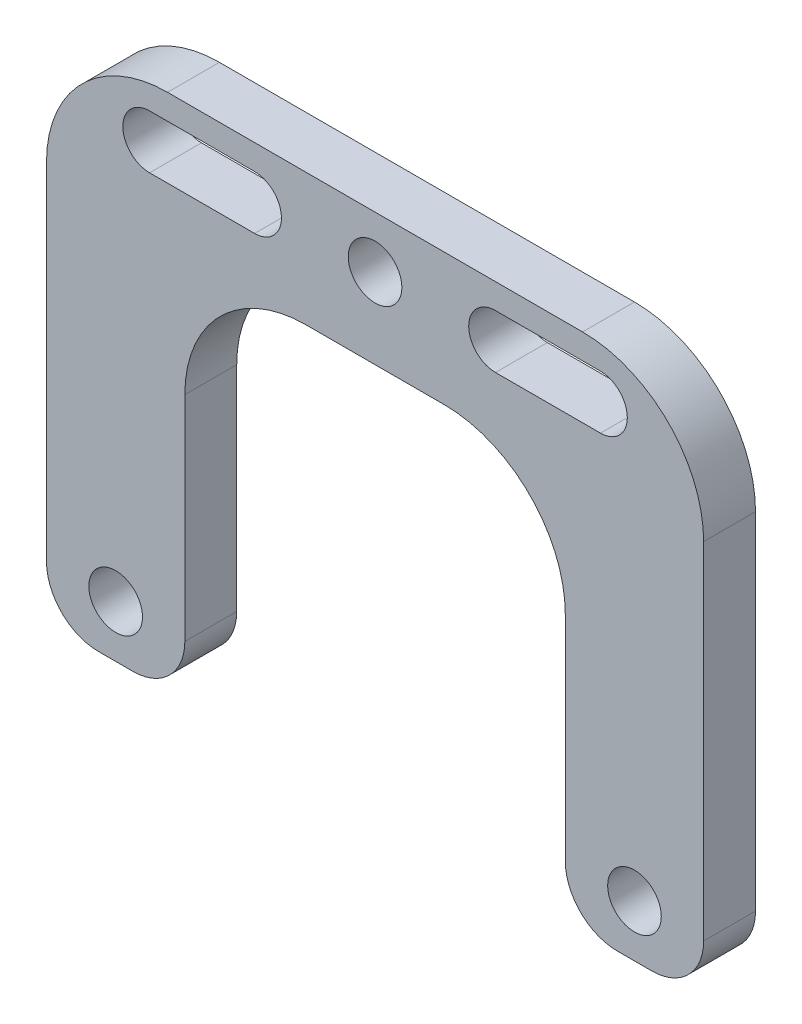
ISO-10303-21;
HEADER;
FILE_DESCRIPTION(('STEP AP214'),'2;1');
FILE_NAME('part.step','',(''),(''),'','','');
FILE_SCHEMA(('AUTOMOTIVE_DESIGN { 1 0 10303 214 1 1 1 1 }'));
ENDSEC;
DATA;
#1=APPLICATION_CONTEXT('core data for automotive mechanical design processes');
#2=APPLICATION_PROTOCOL_DEFINITION('international standard','automotive_design',2000,#1);
#3=PRODUCT_CONTEXT('',#1,'mechanical');
#4=PRODUCT('Part','Part','',(#3));
#5=PRODUCT_RELATED_PRODUCT_CATEGORY('part','',(#4));
#6=PRODUCT_DEFINITION_FORMATION('','',#4);
#7=PRODUCT_DEFINITION_CONTEXT('part definition',#1,'design');
#8=PRODUCT_DEFINITION('design','',#6,#7);
#9=PRODUCT_DEFINITION_SHAPE('','',#8);
#10=(LENGTH_UNIT() NAMED_UNIT(*) SI_UNIT(.MILLI.,.METRE.));
#11=(NAMED_UNIT(*) PLANE_ANGLE_UNIT() SI_UNIT($,.RADIAN.));
#12=(NAMED_UNIT(*) SI_UNIT($,.STERADIAN.) SOLID_ANGLE_UNIT());
#13=UNCERTAINTY_MEASURE_WITH_UNIT(LENGTH_MEASURE(1.E-05),#10,'distance_accuracy_value','');
#14=(GEOMETRIC_REPRESENTATION_CONTEXT(3) GLOBAL_UNCERTAINTY_ASSIGNED_CONTEXT((#13)) GLOBAL_UNIT_ASSIGNED_CONTEXT((#10,
#11,#12)) REPRESENTATION_CONTEXT('',''));
#15=CARTESIAN_POINT('',(0.,0.,0.));
#16=DIRECTION('',(0.,0.,1.));
#17=DIRECTION('',(1.,0.,0.));
#18=AXIS2_PLACEMENT_3D('',#15,#16,#17);
#19=CARTESIAN_POINT('',(19.,-15.,3.));
#20=DIRECTION('',(0.,1.,0.));
#21=DIRECTION('',(-1.,0.,0.));
#22=AXIS2_PLACEMENT_3D('',#19,#20,#21);
#23=PLANE('',#22);
#24=DIRECTION('',(1.,0.,0.));
#25=VECTOR('',#24,1.);
#26=CARTESIAN_POINT('',(19.,-15.,0.));
#27=LINE('',#26,#25);
#28=CARTESIAN_POINT('',(-16.,-15.,0.));
#29=VERTEX_POINT('',#28);
#30=CARTESIAN_POINT('',(-14.,-15.,0.));
#31=VERTEX_POINT('',#30);
#32=EDGE_CURVE('E282',#29,#31,#27,.T.);
#33=ORIENTED_EDGE('',*,*,#32,.T.);
#34=DIRECTION('',(0.,0.,1.));
#35=VECTOR('',#34,1.);
#36=CARTESIAN_POINT('',(-14.,-15.,3.));
#37=LINE('',#36,#35);
#38=CARTESIAN_POINT('',(-14.,-15.,3.));
#39=VERTEX_POINT('',#38);
#40=EDGE_CURVE('E390',#31,#39,#37,.T.);
#41=ORIENTED_EDGE('',*,*,#40,.T.);
#42=DIRECTION('',(1.,0.,0.));
#43=VECTOR('',#42,1.);
#44=CARTESIAN_POINT('',(19.,-15.,3.));
#45=LINE('',#44,#43);
#46=CARTESIAN_POINT('',(-16.,-15.,3.));
#47=VERTEX_POINT('',#46);
#48=EDGE_CURVE('E269',#47,#39,#45,.T.);
#49=ORIENTED_EDGE('',*,*,#48,.F.);
#50=DIRECTION('',(0.,0.,-1.));
#51=VECTOR('',#50,1.);
#52=CARTESIAN_POINT('',(-16.,-15.,3.));
#53=LINE('',#52,#51);
#54=EDGE_CURVE('E387',#47,#29,#53,.T.);
#55=ORIENTED_EDGE('',*,*,#54,.T.);
#56=EDGE_LOOP('',(#33,#41,#49,#55));
#57=FACE_BOUND('',#56,.T.);
#58=ADVANCED_FACE('F37',(#57),#23,.F.);
#59=CARTESIAN_POINT('',(-19.,-15.,3.));
#60=DIRECTION('',(1.,0.,0.));
#61=DIRECTION('',(0.,0.,-1.));
#62=AXIS2_PLACEMENT_3D('',#59,#60,#61);
#63=PLANE('',#62);
#64=DIRECTION('',(0.,-1.,0.));
#65=VECTOR('',#64,1.);
#66=CARTESIAN_POINT('',(-19.,-15.,0.));
#67=LINE('',#66,#65);
#68=CARTESIAN_POINT('',(-19.,8.,0.));
#69=VERTEX_POINT('',#68);
#70=CARTESIAN_POINT('',(-19.,-12.,0.));
#71=VERTEX_POINT('',#70);
#72=EDGE_CURVE('E277',#69,#71,#67,.T.);
#73=ORIENTED_EDGE('',*,*,#72,.T.);
#74=DIRECTION('',(0.,0.,-1.));
#75=VECTOR('',#74,1.);
#76=CARTESIAN_POINT('',(-19.,-12.,3.));
#77=LINE('',#76,#75);
#78=CARTESIAN_POINT('',(-19.,-12.,3.));
#79=VERTEX_POINT('',#78);
#80=EDGE_CURVE('E11',#71,#79,#77,.F.);
#81=ORIENTED_EDGE('',*,*,#80,.T.);
#82=DIRECTION('',(0.,-1.,0.));
#83=VECTOR('',#82,1.);
#84=CARTESIAN_POINT('',(-19.,-15.,3.));
#85=LINE('',#84,#83);
#86=CARTESIAN_POINT('',(-19.,8.,3.));
#87=VERTEX_POINT('',#86);
#88=EDGE_CURVE('E264',#87,#79,#85,.T.);
#89=ORIENTED_EDGE('',*,*,#88,.F.);
#90=DIRECTION('',(0.,0.,-1.));
#91=VECTOR('',#90,1.);
#92=CARTESIAN_POINT('',(-19.,8.,3.));
#93=LINE('',#92,#91);
#94=EDGE_CURVE('E340',#87,#69,#93,.T.);
#95=ORIENTED_EDGE('',*,*,#94,.T.);
#96=EDGE_LOOP('',(#73,#81,#89,#95));
#97=FACE_BOUND('',#96,.T.);
#98=ADVANCED_FACE('F418',(#97),#63,.F.);
#99=CARTESIAN_POINT('',(14.,-15.,0.));
#100=VERTEX_POINT('',#99);
#101=CARTESIAN_POINT('',(16.,-15.,0.));
#102=VERTEX_POINT('',#101);
#103=EDGE_CURVE('E280',#100,#102,#27,.T.);
#104=ORIENTED_EDGE('',*,*,#103,.T.);
#105=DIRECTION('',(0.,0.,-1.));
#106=VECTOR('',#105,1.);
#107=CARTESIAN_POINT('',(16.,-15.,3.));
#108=LINE('',#107,#106);
#109=CARTESIAN_POINT('',(16.,-15.,3.));
#110=VERTEX_POINT('',#109);
#111=EDGE_CURVE('E377',#102,#110,#108,.F.);
#112=ORIENTED_EDGE('',*,*,#111,.T.);
#113=CARTESIAN_POINT('',(14.,-15.,3.));
#114=VERTEX_POINT('',#113);
#115=EDGE_CURVE('E267',#114,#110,#45,.T.);
#116=ORIENTED_EDGE('',*,*,#115,.F.);
#117=DIRECTION('',(0.,0.,1.));
#118=VECTOR('',#117,1.);
#119=CARTESIAN_POINT('',(14.,-15.,3.));
#120=LINE('',#119,#118);
#121=EDGE_CURVE('E375',#114,#100,#120,.F.);
#122=ORIENTED_EDGE('',*,*,#121,.T.);
#123=EDGE_LOOP('',(#104,#112,#116,#122));
#124=FACE_BOUND('',#123,.T.);
#125=ADVANCED_FACE('F445',(#124),#23,.F.);
#126=CARTESIAN_POINT('',(19.,-15.,3.));
#127=DIRECTION('',(-1.,0.,0.));
#128=DIRECTION('',(0.,-1.,0.));
#129=AXIS2_PLACEMENT_3D('',#126,#127,#128);
#130=PLANE('',#129);
#131=DIRECTION('',(0.,1.,0.));
#132=VECTOR('',#131,1.);
#133=CARTESIAN_POINT('',(19.,-15.,3.));
#134=LINE('',#133,#132);
#135=CARTESIAN_POINT('',(19.,-12.,3.));
#136=VERTEX_POINT('',#135);
#137=CARTESIAN_POINT('',(19.,8.,3.));
#138=VERTEX_POINT('',#137);
#139=EDGE_CURVE('E271',#136,#138,#134,.T.);
#140=ORIENTED_EDGE('',*,*,#139,.F.);
#141=DIRECTION('',(0.,0.,-1.));
#142=VECTOR('',#141,1.);
#143=CARTESIAN_POINT('',(19.,-12.,3.));
#144=LINE('',#143,#142);
#145=CARTESIAN_POINT('',(19.,-12.,0.));
#146=VERTEX_POINT('',#145);
#147=EDGE_CURVE('E364',#136,#146,#144,.T.);
#148=ORIENTED_EDGE('',*,*,#147,.T.);
#149=DIRECTION('',(0.,1.,0.));
#150=VECTOR('',#149,1.);
#151=CARTESIAN_POINT('',(19.,-15.,0.));
#152=LINE('',#151,#150);
#153=CARTESIAN_POINT('',(19.,8.,0.));
#154=VERTEX_POINT('',#153);
#155=EDGE_CURVE('E285',#146,#154,#152,.T.);
#156=ORIENTED_EDGE('',*,*,#155,.T.);
#157=DIRECTION('',(0.,0.,-1.));
#158=VECTOR('',#157,1.);
#159=CARTESIAN_POINT('',(19.,8.,3.));
#160=LINE('',#159,#158);
#161=EDGE_CURVE('E333',#154,#138,#160,.F.);
#162=ORIENTED_EDGE('',*,*,#161,.T.);
#163=EDGE_LOOP('',(#140,#148,#156,#162));
#164=FACE_BOUND('',#163,.T.);
#165=ADVANCED_FACE('F437',(#164),#130,.F.);
#166=CARTESIAN_POINT('',(19.,15.,3.));
#167=DIRECTION('',(0.,-1.,0.));
#168=DIRECTION('',(1.,0.,0.));
#169=AXIS2_PLACEMENT_3D('',#166,#167,#168);
#170=PLANE('',#169);
#171=DIRECTION('',(-1.,0.,0.));
#172=VECTOR('',#171,1.);
#173=CARTESIAN_POINT('',(19.,15.,3.));
#174=LINE('',#173,#172);
#175=CARTESIAN_POINT('',(12.,15.,3.));
#176=VERTEX_POINT('',#175);
#177=CARTESIAN_POINT('',(-12.,15.,3.));
#178=VERTEX_POINT('',#177);
#179=EDGE_CURVE('E273',#176,#178,#174,.T.);
#180=ORIENTED_EDGE('',*,*,#179,.F.);
#181=DIRECTION('',(0.,0.,-1.));
#182=VECTOR('',#181,1.);
#183=CARTESIAN_POINT('',(12.,15.,3.));
#184=LINE('',#183,#182);
#185=CARTESIAN_POINT('',(12.,15.,0.));
#186=VERTEX_POINT('',#185);
#187=EDGE_CURVE('E325',#176,#186,#184,.T.);
#188=ORIENTED_EDGE('',*,*,#187,.T.);
#189=DIRECTION('',(-1.,0.,0.));
#190=VECTOR('',#189,1.);
#191=CARTESIAN_POINT('',(19.,15.,0.));
#192=LINE('',#191,#190);
#193=CARTESIAN_POINT('',(-12.,15.,0.));
#194=VERTEX_POINT('',#193);
#195=EDGE_CURVE('E268',#186,#194,#192,.T.);
#196=ORIENTED_EDGE('',*,*,#195,.T.);
#197=DIRECTION('',(0.,0.,-1.));
#198=VECTOR('',#197,1.);
#199=CARTESIAN_POINT('',(-12.,15.,3.));
#200=LINE('',#199,#198);
#201=EDGE_CURVE('E323',#194,#178,#200,.F.);
#202=ORIENTED_EDGE('',*,*,#201,.T.);
#203=EDGE_LOOP('',(#180,#188,#196,#202));
#204=FACE_BOUND('',#203,.T.);
#205=ADVANCED_FACE('F427',(#204),#170,.F.);
#206=CARTESIAN_POINT('',(0.,0.,3.));
#207=DIRECTION('',(0.,0.,1.));
#208=DIRECTION('',(1.,0.,0.));
#209=AXIS2_PLACEMENT_3D('',#206,#207,#208);
#210=PLANE('',#209);
#211=ORIENTED_EDGE('',*,*,#115,.T.);
#212=CARTESIAN_POINT('',(16.,-12.,3.));
#213=DIRECTION('',(0.,0.,1.));
#214=DIRECTION('',(1.,0.,0.));
#215=AXIS2_PLACEMENT_3D('',#212,#213,#214);
#216=CIRCLE('',#215,3.);
#217=EDGE_CURVE('E383',#110,#136,#216,.T.);
#218=ORIENTED_EDGE('',*,*,#217,.T.);
#219=ORIENTED_EDGE('',*,*,#139,.T.);
#220=CARTESIAN_POINT('',(12.,8.,3.));
#221=DIRECTION('',(0.,0.,1.));
#222=DIRECTION('',(1.,0.,0.));
#223=AXIS2_PLACEMENT_3D('',#220,#221,#222);
#224=CIRCLE('',#223,7.);
#225=EDGE_CURVE('E338',#138,#176,#224,.T.);
#226=ORIENTED_EDGE('',*,*,#225,.T.);
#227=ORIENTED_EDGE('',*,*,#179,.T.);
#228=CARTESIAN_POINT('',(-12.,8.,3.));
#229=DIRECTION('',(0.,0.,1.));
#230=DIRECTION('',(1.,0.,0.));
#231=AXIS2_PLACEMENT_3D('',#228,#229,#230);
#232=CIRCLE('',#231,7.);
#233=EDGE_CURVE('E336',#178,#87,#232,.T.);
#234=ORIENTED_EDGE('',*,*,#233,.T.);
#235=ORIENTED_EDGE('',*,*,#88,.T.);
#236=CARTESIAN_POINT('',(-16.,-12.,3.));
#237=DIRECTION('',(0.,0.,1.));
#238=DIRECTION('',(1.,0.,0.));
#239=AXIS2_PLACEMENT_3D('',#236,#237,#238);
#240=CIRCLE('',#239,3.);
#241=EDGE_CURVE('E379',#79,#47,#240,.T.);
#242=ORIENTED_EDGE('',*,*,#241,.T.);
#243=ORIENTED_EDGE('',*,*,#48,.T.);
#244=CARTESIAN_POINT('',(-14.,-12.,3.));
#245=DIRECTION('',(0.,0.,1.));
#246=DIRECTION('',(1.,0.,0.));
#247=AXIS2_PLACEMENT_3D('',#244,#245,#246);
#248=CIRCLE('',#247,3.);
#249=CARTESIAN_POINT('',(-11.,-12.,3.));
#250=VERTEX_POINT('',#249);
#251=EDGE_CURVE('E60',#39,#250,#248,.T.);
#252=ORIENTED_EDGE('',*,*,#251,.T.);
#253=DIRECTION('',(0.,1.,0.));
#254=VECTOR('',#253,1.);
#255=CARTESIAN_POINT('',(-11.,-15.,3.));
#256=LINE('',#255,#254);
#257=CARTESIAN_POINT('',(-11.,0.358896132072791,3.));
#258=VERTEX_POINT('',#257);
#259=EDGE_CURVE('E260',#250,#258,#256,.T.);
#260=ORIENTED_EDGE('',*,*,#259,.T.);
#261=CARTESIAN_POINT('',(-4.,0.358896132072795,3.));
#262=DIRECTION('',(0.,0.,1.));
#263=DIRECTION('',(1.,0.,0.));
#264=AXIS2_PLACEMENT_3D('',#261,#262,#263);
#265=CIRCLE('',#264,7.);
#266=CARTESIAN_POINT('',(-4.,7.35889613207279,3.));
#267=VERTEX_POINT('',#266);
#268=EDGE_CURVE('E359',#258,#267,#265,.F.);
#269=ORIENTED_EDGE('',*,*,#268,.T.);
#270=DIRECTION('',(1.,0.,0.));
#271=VECTOR('',#270,1.);
#272=CARTESIAN_POINT('',(-11.,7.35889613207279,3.));
#273=LINE('',#272,#271);
#274=CARTESIAN_POINT('',(4.,7.35889613207279,3.));
#275=VERTEX_POINT('',#274);
#276=EDGE_CURVE('E451',#267,#275,#273,.T.);
#277=ORIENTED_EDGE('',*,*,#276,.T.);
#278=CARTESIAN_POINT('',(4.,0.358896132072794,3.));
#279=DIRECTION('',(0.,0.,1.));
#280=DIRECTION('',(1.,0.,0.));
#281=AXIS2_PLACEMENT_3D('',#278,#279,#280);
#282=CIRCLE('',#281,7.);
#283=CARTESIAN_POINT('',(11.,0.358896132072791,3.));
#284=VERTEX_POINT('',#283);
#285=EDGE_CURVE('E354',#275,#284,#282,.F.);
#286=ORIENTED_EDGE('',*,*,#285,.T.);
#287=DIRECTION('',(0.,1.,0.));
#288=VECTOR('',#287,1.);
#289=CARTESIAN_POINT('',(11.,-15.,3.));
#290=LINE('',#289,#288);
#291=CARTESIAN_POINT('',(11.,-12.,3.));
#292=VERTEX_POINT('',#291);
#293=EDGE_CURVE('E447',#292,#284,#290,.T.);
#294=ORIENTED_EDGE('',*,*,#293,.F.);
#295=CARTESIAN_POINT('',(14.,-12.,3.));
#296=DIRECTION('',(0.,0.,1.));
#297=DIRECTION('',(1.,0.,0.));
#298=AXIS2_PLACEMENT_3D('',#295,#296,#297);
#299=CIRCLE('',#298,3.);
#300=EDGE_CURVE('E52',#292,#114,#299,.T.);
#301=ORIENTED_EDGE('',*,*,#300,.T.);
#302=EDGE_LOOP('',(#211,#218,#219,#226,#227,#234,#235,#242,#243,#252,#260,#269,#277,#286,#294,#301));
#303=FACE_BOUND('',#302,.T.);
#304=CARTESIAN_POINT('',(14.9999999999999,-12.,3.));
#305=DIRECTION('',(0.,0.,1.));
#306=DIRECTION('',(-1.,0.,0.));
#307=AXIS2_PLACEMENT_3D('',#304,#305,#306);
#308=CIRCLE('',#307,1.55);
#309=CARTESIAN_POINT('',(13.4499999999999,-12.,3.));
#310=VERTEX_POINT('',#309);
#311=EDGE_CURVE('E257',#310,#310,#308,.T.);
#312=ORIENTED_EDGE('',*,*,#311,.F.);
#313=EDGE_LOOP('',(#312));
#314=FACE_BOUND('',#313,.T.);
#315=CARTESIAN_POINT('',(-15.,-12.,3.));
#316=DIRECTION('',(0.,0.,1.));
#317=DIRECTION('',(1.,0.,0.));
#318=AXIS2_PLACEMENT_3D('',#315,#316,#317);
#319=CIRCLE('',#318,1.55);
#320=CARTESIAN_POINT('',(-13.45,-12.,3.));
#321=VERTEX_POINT('',#320);
#322=EDGE_CURVE('E237',#321,#321,#319,.T.);
#323=ORIENTED_EDGE('',*,*,#322,.F.);
#324=EDGE_LOOP('',(#323));
#325=FACE_BOUND('',#324,.T.);
#326=CARTESIAN_POINT('',(-6.9637445316297,12.,3.));
#327=DIRECTION('',(0.,0.,1.));
#328=DIRECTION('',(-1.,0.,0.));
#329=AXIS2_PLACEMENT_3D('',#326,#327,#328);
#330=CIRCLE('',#329,1.55);
#331=CARTESIAN_POINT('',(-6.9637445316297,10.45,3.));
#332=VERTEX_POINT('',#331);
#333=CARTESIAN_POINT('',(-6.96374453162969,13.55,3.));
#334=VERTEX_POINT('',#333);
#335=EDGE_CURVE('E234',#332,#334,#330,.T.);
#336=ORIENTED_EDGE('',*,*,#335,.F.);
#337=DIRECTION('',(1.,0.,0.));
#338=VECTOR('',#337,1.);
#339=CARTESIAN_POINT('',(-6.9637445316297,10.45,3.));
#340=LINE('',#339,#338);
#341=CARTESIAN_POINT('',(-13.0362554683703,10.45,3.));
#342=VERTEX_POINT('',#341);
#343=EDGE_CURVE('E243',#342,#332,#340,.T.);
#344=ORIENTED_EDGE('',*,*,#343,.F.);
#345=CARTESIAN_POINT('',(-13.0362554683703,12.,3.));
#346=DIRECTION('',(0.,0.,1.));
#347=DIRECTION('',(-1.,0.,0.));
#348=AXIS2_PLACEMENT_3D('',#345,#346,#347);
#349=CIRCLE('',#348,1.55);
#350=CARTESIAN_POINT('',(-13.0362554683703,13.55,3.));
#351=VERTEX_POINT('',#350);
#352=EDGE_CURVE('E240',#351,#342,#349,.T.);
#353=ORIENTED_EDGE('',*,*,#352,.F.);
#354=DIRECTION('',(-1.,0.,0.));
#355=VECTOR('',#354,1.);
#356=CARTESIAN_POINT('',(-6.96374453162969,13.55,3.));
#357=LINE('',#356,#355);
#358=EDGE_CURVE('E236',#334,#351,#357,.T.);
#359=ORIENTED_EDGE('',*,*,#358,.F.);
#360=EDGE_LOOP('',(#336,#344,#353,#359));
#361=FACE_BOUND('',#360,.T.);
#362=CARTESIAN_POINT('',(6.9637445316297,12.,3.));
#363=DIRECTION('',(0.,0.,1.));
#364=DIRECTION('',(1.,0.,0.));
#365=AXIS2_PLACEMENT_3D('',#362,#363,#364);
#366=CIRCLE('',#365,1.55);
#367=CARTESIAN_POINT('',(6.9637445316297,13.55,3.));
#368=VERTEX_POINT('',#367);
#369=CARTESIAN_POINT('',(6.9637445316297,10.45,3.));
#370=VERTEX_POINT('',#369);
#371=EDGE_CURVE('E219',#368,#370,#366,.T.);
#372=ORIENTED_EDGE('',*,*,#371,.F.);
#373=DIRECTION('',(-1.,0.,0.));
#374=VECTOR('',#373,1.);
#375=CARTESIAN_POINT('',(6.9637445316297,13.55,3.));
#376=LINE('',#375,#374);
#377=CARTESIAN_POINT('',(13.0362554683703,13.55,3.));
#378=VERTEX_POINT('',#377);
#379=EDGE_CURVE('E224',#378,#368,#376,.T.);
#380=ORIENTED_EDGE('',*,*,#379,.F.);
#381=CARTESIAN_POINT('',(13.0362554683703,12.,3.));
#382=DIRECTION('',(0.,0.,1.));
#383=DIRECTION('',(1.,0.,0.));
#384=AXIS2_PLACEMENT_3D('',#381,#382,#383);
#385=CIRCLE('',#384,1.55);
#386=CARTESIAN_POINT('',(13.0362554683703,10.45,3.));
#387=VERTEX_POINT('',#386);
#388=EDGE_CURVE('E203',#387,#378,#385,.T.);
#389=ORIENTED_EDGE('',*,*,#388,.F.);
#390=DIRECTION('',(1.,0.,0.));
#391=VECTOR('',#390,1.);
#392=CARTESIAN_POINT('',(6.9637445316297,10.45,3.));
#393=LINE('',#392,#391);
#394=EDGE_CURVE('E214',#370,#387,#393,.T.);
#395=ORIENTED_EDGE('',*,*,#394,.F.);
#396=EDGE_LOOP('',(#372,#380,#389,#395));
#397=FACE_BOUND('',#396,.T.);
#398=CARTESIAN_POINT('',(0.,12.,3.));
#399=DIRECTION('',(0.,0.,1.));
#400=DIRECTION('',(1.,0.,0.));
#401=AXIS2_PLACEMENT_3D('',#398,#399,#400);
#402=CIRCLE('',#401,1.55);
#403=CARTESIAN_POINT('',(1.55,12.,3.));
#404=VERTEX_POINT('',#403);
#405=EDGE_CURVE('E231',#404,#404,#402,.T.);
#406=ORIENTED_EDGE('',*,*,#405,.F.);
#407=EDGE_LOOP('',(#406));
#408=FACE_BOUND('',#407,.T.);
#409=ADVANCED_FACE('F221',(#303,#314,#325,#361,#397,#408),#210,.T.);
#410=CARTESIAN_POINT('',(0.,0.,0.));
#411=DIRECTION('',(0.,0.,1.));
#412=DIRECTION('',(1.,0.,0.));
#413=AXIS2_PLACEMENT_3D('',#410,#411,#412);
#414=PLANE('',#413);
#415=CARTESIAN_POINT('',(14.9999999999999,-12.,0.));
#416=DIRECTION('',(0.,0.,1.));
#417=DIRECTION('',(1.,0.,0.));
#418=AXIS2_PLACEMENT_3D('',#415,#416,#417);
#419=CIRCLE('',#418,1.55);
#420=CARTESIAN_POINT('',(16.5499999999999,-12.,0.));
#421=VERTEX_POINT('',#420);
#422=EDGE_CURVE('E281',#421,#421,#419,.T.);
#423=ORIENTED_EDGE('',*,*,#422,.T.);
#424=EDGE_LOOP('',(#423));
#425=FACE_BOUND('',#424,.T.);
#426=CARTESIAN_POINT('',(-15.,-12.,0.));
#427=DIRECTION('',(0.,0.,1.));
#428=DIRECTION('',(1.,0.,0.));
#429=AXIS2_PLACEMENT_3D('',#426,#427,#428);
#430=CIRCLE('',#429,1.55);
#431=CARTESIAN_POINT('',(-13.45,-12.,0.));
#432=VERTEX_POINT('',#431);
#433=EDGE_CURVE('E291',#432,#432,#430,.T.);
#434=ORIENTED_EDGE('',*,*,#433,.T.);
#435=EDGE_LOOP('',(#434));
#436=FACE_BOUND('',#435,.T.);
#437=DIRECTION('',(1.,0.,0.));
#438=VECTOR('',#437,1.);
#439=CARTESIAN_POINT('',(0.,10.45,0.));
#440=LINE('',#439,#438);
#441=CARTESIAN_POINT('',(-13.0362554683703,10.45,0.));
#442=VERTEX_POINT('',#441);
#443=CARTESIAN_POINT('',(-6.9637445316297,10.45,0.));
#444=VERTEX_POINT('',#443);
#445=EDGE_CURVE('E306',#442,#444,#440,.T.);
#446=ORIENTED_EDGE('',*,*,#445,.T.);
#447=CARTESIAN_POINT('',(-6.9637445316297,12.,0.));
#448=DIRECTION('',(0.,0.,1.));
#449=DIRECTION('',(1.,0.,0.));
#450=AXIS2_PLACEMENT_3D('',#447,#448,#449);
#451=CIRCLE('',#450,1.55);
#452=CARTESIAN_POINT('',(-6.96374453162969,13.55,0.));
#453=VERTEX_POINT('',#452);
#454=EDGE_CURVE('E309',#444,#453,#451,.T.);
#455=ORIENTED_EDGE('',*,*,#454,.T.);
#456=DIRECTION('',(-1.,0.,0.));
#457=VECTOR('',#456,1.);
#458=CARTESIAN_POINT('',(0.,13.55,0.));
#459=LINE('',#458,#457);
#460=CARTESIAN_POINT('',(-13.0362554683703,13.55,0.));
#461=VERTEX_POINT('',#460);
#462=EDGE_CURVE('E300',#453,#461,#459,.T.);
#463=ORIENTED_EDGE('',*,*,#462,.T.);
#464=CARTESIAN_POINT('',(-13.0362554683703,12.,0.));
#465=DIRECTION('',(0.,0.,1.));
#466=DIRECTION('',(1.,0.,0.));
#467=AXIS2_PLACEMENT_3D('',#464,#465,#466);
#468=CIRCLE('',#467,1.55);
#469=EDGE_CURVE('E303',#461,#442,#468,.T.);
#470=ORIENTED_EDGE('',*,*,#469,.T.);
#471=EDGE_LOOP('',(#446,#455,#463,#470));
#472=FACE_BOUND('',#471,.T.);
#473=DIRECTION('',(-1.,0.,0.));
#474=VECTOR('',#473,1.);
#475=CARTESIAN_POINT('',(0.,13.55,0.));
#476=LINE('',#475,#474);
#477=CARTESIAN_POINT('',(13.0362554683703,13.55,0.));
#478=VERTEX_POINT('',#477);
#479=CARTESIAN_POINT('',(6.9637445316297,13.55,0.));
#480=VERTEX_POINT('',#479);
#481=EDGE_CURVE('E294',#478,#480,#476,.T.);
#482=ORIENTED_EDGE('',*,*,#481,.T.);
#483=CARTESIAN_POINT('',(6.9637445316297,12.,0.));
#484=DIRECTION('',(0.,0.,1.));
#485=DIRECTION('',(1.,0.,0.));
#486=AXIS2_PLACEMENT_3D('',#483,#484,#485);
#487=CIRCLE('',#486,1.55);
#488=CARTESIAN_POINT('',(6.9637445316297,10.45,0.));
#489=VERTEX_POINT('',#488);
#490=EDGE_CURVE('E297',#480,#489,#487,.T.);
#491=ORIENTED_EDGE('',*,*,#490,.T.);
#492=DIRECTION('',(1.,0.,0.));
#493=VECTOR('',#492,1.);
#494=CARTESIAN_POINT('',(0.,10.45,0.));
#495=LINE('',#494,#493);
#496=CARTESIAN_POINT('',(13.0362554683703,10.45,0.));
#497=VERTEX_POINT('',#496);
#498=EDGE_CURVE('E276',#489,#497,#495,.T.);
#499=ORIENTED_EDGE('',*,*,#498,.T.);
#500=CARTESIAN_POINT('',(13.0362554683703,12.,0.));
#501=DIRECTION('',(0.,0.,1.));
#502=DIRECTION('',(1.,0.,0.));
#503=AXIS2_PLACEMENT_3D('',#500,#501,#502);
#504=CIRCLE('',#503,1.55);
#505=EDGE_CURVE('E206',#497,#478,#504,.T.);
#506=ORIENTED_EDGE('',*,*,#505,.T.);
#507=EDGE_LOOP('',(#482,#491,#499,#506));
#508=FACE_BOUND('',#507,.T.);
#509=CARTESIAN_POINT('',(0.,12.,0.));
#510=DIRECTION('',(0.,0.,1.));
#511=DIRECTION('',(1.,0.,0.));
#512=AXIS2_PLACEMENT_3D('',#509,#510,#511);
#513=CIRCLE('',#512,1.55);
#514=CARTESIAN_POINT('',(1.55,12.,0.));
#515=VERTEX_POINT('',#514);
#516=EDGE_CURVE('E263',#515,#515,#513,.T.);
#517=ORIENTED_EDGE('',*,*,#516,.T.);
#518=EDGE_LOOP('',(#517));
#519=FACE_BOUND('',#518,.T.);
#520=ORIENTED_EDGE('',*,*,#155,.F.);
#521=CARTESIAN_POINT('',(16.,-12.,0.));
#522=DIRECTION('',(0.,0.,1.));
#523=DIRECTION('',(1.,0.,0.));
#524=AXIS2_PLACEMENT_3D('',#521,#522,#523);
#525=CIRCLE('',#524,3.);
#526=EDGE_CURVE('E373',#146,#102,#525,.F.);
#527=ORIENTED_EDGE('',*,*,#526,.T.);
#528=ORIENTED_EDGE('',*,*,#103,.F.);
#529=CARTESIAN_POINT('',(14.,-12.,0.));
#530=DIRECTION('',(0.,0.,1.));
#531=DIRECTION('',(1.,0.,0.));
#532=AXIS2_PLACEMENT_3D('',#529,#530,#531);
#533=CIRCLE('',#532,3.);
#534=CARTESIAN_POINT('',(11.,-12.,0.));
#535=VERTEX_POINT('',#534);
#536=EDGE_CURVE('E371',#100,#535,#533,.F.);
#537=ORIENTED_EDGE('',*,*,#536,.T.);
#538=DIRECTION('',(0.,1.,0.));
#539=VECTOR('',#538,1.);
#540=CARTESIAN_POINT('',(11.,0.,0.));
#541=LINE('',#540,#539);
#542=CARTESIAN_POINT('',(11.,0.358896132072794,0.));
#543=VERTEX_POINT('',#542);
#544=EDGE_CURVE('E321',#535,#543,#541,.T.);
#545=ORIENTED_EDGE('',*,*,#544,.T.);
#546=CARTESIAN_POINT('',(4.,0.358896132072794,0.));
#547=DIRECTION('',(0.,0.,1.));
#548=DIRECTION('',(1.,0.,0.));
#549=AXIS2_PLACEMENT_3D('',#546,#547,#548);
#550=CIRCLE('',#549,7.);
#551=CARTESIAN_POINT('',(4.,7.35889613207279,0.));
#552=VERTEX_POINT('',#551);
#553=EDGE_CURVE('E357',#543,#552,#550,.T.);
#554=ORIENTED_EDGE('',*,*,#553,.T.);
#555=DIRECTION('',(1.,0.,0.));
#556=VECTOR('',#555,1.);
#557=CARTESIAN_POINT('',(0.,7.35889613207279,0.));
#558=LINE('',#557,#556);
#559=CARTESIAN_POINT('',(-4.,7.35889613207279,0.));
#560=VERTEX_POINT('',#559);
#561=EDGE_CURVE('E312',#560,#552,#558,.T.);
#562=ORIENTED_EDGE('',*,*,#561,.F.);
#563=CARTESIAN_POINT('',(-4.,0.358896132072795,0.));
#564=DIRECTION('',(0.,0.,1.));
#565=DIRECTION('',(1.,0.,0.));
#566=AXIS2_PLACEMENT_3D('',#563,#564,#565);
#567=CIRCLE('',#566,7.);
#568=CARTESIAN_POINT('',(-11.,0.358896132072795,0.));
#569=VERTEX_POINT('',#568);
#570=EDGE_CURVE('E361',#560,#569,#567,.T.);
#571=ORIENTED_EDGE('',*,*,#570,.T.);
#572=DIRECTION('',(0.,1.,0.));
#573=VECTOR('',#572,1.);
#574=CARTESIAN_POINT('',(-11.,0.,0.));
#575=LINE('',#574,#573);
#576=CARTESIAN_POINT('',(-11.,-12.,0.));
#577=VERTEX_POINT('',#576);
#578=EDGE_CURVE('E319',#577,#569,#575,.T.);
#579=ORIENTED_EDGE('',*,*,#578,.F.);
#580=CARTESIAN_POINT('',(-14.,-12.,0.));
#581=DIRECTION('',(0.,0.,1.));
#582=DIRECTION('',(1.,0.,0.));
#583=AXIS2_PLACEMENT_3D('',#580,#581,#582);
#584=CIRCLE('',#583,3.);
#585=EDGE_CURVE('E369',#577,#31,#584,.F.);
#586=ORIENTED_EDGE('',*,*,#585,.T.);
#587=ORIENTED_EDGE('',*,*,#32,.F.);
#588=CARTESIAN_POINT('',(-16.,-12.,0.));
#589=DIRECTION('',(0.,0.,1.));
#590=DIRECTION('',(1.,0.,0.));
#591=AXIS2_PLACEMENT_3D('',#588,#589,#590);
#592=CIRCLE('',#591,3.);
#593=EDGE_CURVE('E367',#29,#71,#592,.F.);
#594=ORIENTED_EDGE('',*,*,#593,.T.);
#595=ORIENTED_EDGE('',*,*,#72,.F.);
#596=CARTESIAN_POINT('',(-12.,8.,0.));
#597=DIRECTION('',(0.,0.,1.));
#598=DIRECTION('',(1.,0.,0.));
#599=AXIS2_PLACEMENT_3D('',#596,#597,#598);
#600=CIRCLE('',#599,7.);
#601=EDGE_CURVE('E328',#69,#194,#600,.F.);
#602=ORIENTED_EDGE('',*,*,#601,.T.);
#603=ORIENTED_EDGE('',*,*,#195,.F.);
#604=CARTESIAN_POINT('',(12.,8.,0.));
#605=DIRECTION('',(0.,0.,1.));
#606=DIRECTION('',(1.,0.,0.));
#607=AXIS2_PLACEMENT_3D('',#604,#605,#606);
#608=CIRCLE('',#607,7.);
#609=EDGE_CURVE('E330',#186,#154,#608,.F.);
#610=ORIENTED_EDGE('',*,*,#609,.T.);
#611=EDGE_LOOP('',(#520,#527,#528,#537,#545,#554,#562,#571,#579,#586,#587,#594,#595,#602,#603,#610));
#612=FACE_BOUND('',#611,.T.);
#613=ADVANCED_FACE('F400',(#425,#436,#472,#508,#519,#612),#414,.F.);
#614=CARTESIAN_POINT('',(0.,12.,-7.));
#615=DIRECTION('',(0.,0.,1.));
#616=DIRECTION('',(1.,0.,0.));
#617=AXIS2_PLACEMENT_3D('',#614,#615,#616);
#618=CYLINDRICAL_SURFACE('',#617,1.55);
#619=ORIENTED_EDGE('',*,*,#405,.T.);
#620=EDGE_LOOP('',(#619));
#621=FACE_BOUND('',#620,.T.);
#622=ORIENTED_EDGE('',*,*,#516,.F.);
#623=EDGE_LOOP('',(#622));
#624=FACE_BOUND('',#623,.T.);
#625=ADVANCED_FACE('F463',(#621,#624),#618,.F.);
#626=CARTESIAN_POINT('',(6.9637445316297,12.,-7.));
#627=DIRECTION('',(0.,0.,1.));
#628=DIRECTION('',(1.,0.,0.));
#629=AXIS2_PLACEMENT_3D('',#626,#627,#628);
#630=CYLINDRICAL_SURFACE('',#629,1.55);
#631=DIRECTION('',(0.,0.,1.));
#632=VECTOR('',#631,1.);
#633=CARTESIAN_POINT('',(6.9637445316297,13.55,-7.));
#634=LINE('',#633,#632);
#635=EDGE_CURVE('E229',#480,#368,#634,.T.);
#636=ORIENTED_EDGE('',*,*,#635,.T.);
#637=ORIENTED_EDGE('',*,*,#371,.T.);
#638=DIRECTION('',(0.,0.,1.));
#639=VECTOR('',#638,1.);
#640=CARTESIAN_POINT('',(6.9637445316297,10.45,-7.));
#641=LINE('',#640,#639);
#642=EDGE_CURVE('E210',#489,#370,#641,.T.);
#643=ORIENTED_EDGE('',*,*,#642,.F.);
#644=ORIENTED_EDGE('',*,*,#490,.F.);
#645=EDGE_LOOP('',(#636,#637,#643,#644));
#646=FACE_BOUND('',#645,.T.);
#647=ADVANCED_FACE('F456',(#646),#630,.F.);
#648=CARTESIAN_POINT('',(6.9637445316297,13.55,-7.));
#649=DIRECTION('',(0.,1.,0.));
#650=DIRECTION('',(-1.,0.,0.));
#651=AXIS2_PLACEMENT_3D('',#648,#649,#650);
#652=PLANE('',#651);
#653=DIRECTION('',(0.,0.,1.));
#654=VECTOR('',#653,1.);
#655=CARTESIAN_POINT('',(13.0362554683703,13.55,-7.));
#656=LINE('',#655,#654);
#657=EDGE_CURVE('E209',#478,#378,#656,.T.);
#658=ORIENTED_EDGE('',*,*,#657,.T.);
#659=ORIENTED_EDGE('',*,*,#379,.T.);
#660=ORIENTED_EDGE('',*,*,#635,.F.);
#661=ORIENTED_EDGE('',*,*,#481,.F.);
#662=EDGE_LOOP('',(#658,#659,#660,#661));
#663=FACE_BOUND('',#662,.T.);
#664=ADVANCED_FACE('F459',(#663),#652,.F.);
#665=CARTESIAN_POINT('',(13.0362554683703,12.,-7.));
#666=DIRECTION('',(0.,0.,1.));
#667=DIRECTION('',(1.,0.,0.));
#668=AXIS2_PLACEMENT_3D('',#665,#666,#667);
#669=CYLINDRICAL_SURFACE('',#668,1.55);
#670=DIRECTION('',(0.,0.,1.));
#671=VECTOR('',#670,1.);
#672=CARTESIAN_POINT('',(13.0362554683703,10.45,-7.));
#673=LINE('',#672,#671);
#674=EDGE_CURVE('E198',#497,#387,#673,.T.);
#675=ORIENTED_EDGE('',*,*,#674,.T.);
#676=ORIENTED_EDGE('',*,*,#388,.T.);
#677=ORIENTED_EDGE('',*,*,#657,.F.);
#678=ORIENTED_EDGE('',*,*,#505,.F.);
#679=EDGE_LOOP('',(#675,#676,#677,#678));
#680=FACE_BOUND('',#679,.T.);
#681=ADVANCED_FACE('F200',(#680),#669,.F.);
#682=CARTESIAN_POINT('',(6.9637445316297,10.45,-7.));
#683=DIRECTION('',(0.,-1.,0.));
#684=DIRECTION('',(1.,0.,0.));
#685=AXIS2_PLACEMENT_3D('',#682,#683,#684);
#686=PLANE('',#685);
#687=ORIENTED_EDGE('',*,*,#642,.T.);
#688=ORIENTED_EDGE('',*,*,#394,.T.);
#689=ORIENTED_EDGE('',*,*,#674,.F.);
#690=ORIENTED_EDGE('',*,*,#498,.F.);
#691=EDGE_LOOP('',(#687,#688,#689,#690));
#692=FACE_BOUND('',#691,.T.);
#693=ADVANCED_FACE('F215',(#692),#686,.F.);
#694=CARTESIAN_POINT('',(-6.9637445316297,12.,-7.));
#695=DIRECTION('',(0.,0.,1.));
#696=DIRECTION('',(1.,0.,0.));
#697=AXIS2_PLACEMENT_3D('',#694,#695,#696);
#698=CYLINDRICAL_SURFACE('',#697,1.55);
#699=DIRECTION('',(0.,0.,1.));
#700=VECTOR('',#699,1.);
#701=CARTESIAN_POINT('',(-6.9637445316297,10.45,-7.));
#702=LINE('',#701,#700);
#703=EDGE_CURVE('E247',#444,#332,#702,.T.);
#704=ORIENTED_EDGE('',*,*,#703,.T.);
#705=ORIENTED_EDGE('',*,*,#335,.T.);
#706=DIRECTION('',(0.,0.,1.));
#707=VECTOR('',#706,1.);
#708=CARTESIAN_POINT('',(-6.96374453162969,13.55,-7.));
#709=LINE('',#708,#707);
#710=EDGE_CURVE('E246',#453,#334,#709,.T.);
#711=ORIENTED_EDGE('',*,*,#710,.F.);
#712=ORIENTED_EDGE('',*,*,#454,.F.);
#713=EDGE_LOOP('',(#704,#705,#711,#712));
#714=FACE_BOUND('',#713,.T.);
#715=ADVANCED_FACE('F585',(#714),#698,.F.);
#716=CARTESIAN_POINT('',(-6.9637445316297,10.45,-7.));
#717=DIRECTION('',(0.,-1.,0.));
#718=DIRECTION('',(1.,0.,0.));
#719=AXIS2_PLACEMENT_3D('',#716,#717,#718);
#720=PLANE('',#719);
#721=DIRECTION('',(0.,0.,1.));
#722=VECTOR('',#721,1.);
#723=CARTESIAN_POINT('',(-13.0362554683703,10.45,-7.));
#724=LINE('',#723,#722);
#725=EDGE_CURVE('E249',#442,#342,#724,.T.);
#726=ORIENTED_EDGE('',*,*,#725,.T.);
#727=ORIENTED_EDGE('',*,*,#343,.T.);
#728=ORIENTED_EDGE('',*,*,#703,.F.);
#729=ORIENTED_EDGE('',*,*,#445,.F.);
#730=EDGE_LOOP('',(#726,#727,#728,#729));
#731=FACE_BOUND('',#730,.T.);
#732=ADVANCED_FACE('F587',(#731),#720,.F.);
#733=CARTESIAN_POINT('',(-13.0362554683703,12.,-7.));
#734=DIRECTION('',(0.,0.,1.));
#735=DIRECTION('',(1.,0.,0.));
#736=AXIS2_PLACEMENT_3D('',#733,#734,#735);
#737=CYLINDRICAL_SURFACE('',#736,1.55);
#738=DIRECTION('',(0.,0.,1.));
#739=VECTOR('',#738,1.);
#740=CARTESIAN_POINT('',(-13.0362554683703,13.55,-7.));
#741=LINE('',#740,#739);
#742=EDGE_CURVE('E251',#461,#351,#741,.T.);
#743=ORIENTED_EDGE('',*,*,#742,.T.);
#744=ORIENTED_EDGE('',*,*,#352,.T.);
#745=ORIENTED_EDGE('',*,*,#725,.F.);
#746=ORIENTED_EDGE('',*,*,#469,.F.);
#747=EDGE_LOOP('',(#743,#744,#745,#746));
#748=FACE_BOUND('',#747,.T.);
#749=ADVANCED_FACE('F590',(#748),#737,.F.);
#750=CARTESIAN_POINT('',(-6.96374453162969,13.55,-7.));
#751=DIRECTION('',(0.,1.,0.));
#752=DIRECTION('',(-1.,0.,0.));
#753=AXIS2_PLACEMENT_3D('',#750,#751,#752);
#754=PLANE('',#753);
#755=ORIENTED_EDGE('',*,*,#710,.T.);
#756=ORIENTED_EDGE('',*,*,#358,.T.);
#757=ORIENTED_EDGE('',*,*,#742,.F.);
#758=ORIENTED_EDGE('',*,*,#462,.F.);
#759=EDGE_LOOP('',(#755,#756,#757,#758));
#760=FACE_BOUND('',#759,.T.);
#761=ADVANCED_FACE('F594',(#760),#754,.F.);
#762=CARTESIAN_POINT('',(-15.,-12.,-7.));
#763=DIRECTION('',(0.,0.,1.));
#764=DIRECTION('',(1.,0.,0.));
#765=AXIS2_PLACEMENT_3D('',#762,#763,#764);
#766=CYLINDRICAL_SURFACE('',#765,1.55);
#767=ORIENTED_EDGE('',*,*,#322,.T.);
#768=EDGE_LOOP('',(#767));
#769=FACE_BOUND('',#768,.T.);
#770=ORIENTED_EDGE('',*,*,#433,.F.);
#771=EDGE_LOOP('',(#770));
#772=FACE_BOUND('',#771,.T.);
#773=ADVANCED_FACE('F598',(#769,#772),#766,.F.);
#774=CARTESIAN_POINT('',(14.9999999999999,-12.,-7.));
#775=DIRECTION('',(0.,0.,1.));
#776=DIRECTION('',(1.,0.,0.));
#777=AXIS2_PLACEMENT_3D('',#774,#775,#776);
#778=CYLINDRICAL_SURFACE('',#777,1.55);
#779=ORIENTED_EDGE('',*,*,#311,.T.);
#780=EDGE_LOOP('',(#779));
#781=FACE_BOUND('',#780,.T.);
#782=ORIENTED_EDGE('',*,*,#422,.F.);
#783=EDGE_LOOP('',(#782));
#784=FACE_BOUND('',#783,.T.);
#785=ADVANCED_FACE('F512',(#781,#784),#778,.F.);
#786=CARTESIAN_POINT('',(11.,-15.,-7.));
#787=DIRECTION('',(1.,0.,0.));
#788=DIRECTION('',(0.,0.,-1.));
#789=AXIS2_PLACEMENT_3D('',#786,#787,#788);
#790=PLANE('',#789);
#791=ORIENTED_EDGE('',*,*,#544,.F.);
#792=DIRECTION('',(0.,0.,1.));
#793=VECTOR('',#792,1.);
#794=CARTESIAN_POINT('',(11.,-12.,-7.));
#795=LINE('',#794,#793);
#796=EDGE_CURVE('E385',#535,#292,#795,.T.);
#797=ORIENTED_EDGE('',*,*,#796,.T.);
#798=ORIENTED_EDGE('',*,*,#293,.T.);
#799=DIRECTION('',(0.,0.,1.));
#800=VECTOR('',#799,1.);
#801=CARTESIAN_POINT('',(11.,0.358896132072795,-7.));
#802=LINE('',#801,#800);
#803=EDGE_CURVE('E348',#284,#543,#802,.F.);
#804=ORIENTED_EDGE('',*,*,#803,.T.);
#805=EDGE_LOOP('',(#791,#797,#798,#804));
#806=FACE_BOUND('',#805,.T.);
#807=ADVANCED_FACE('F507',(#806),#790,.F.);
#808=CARTESIAN_POINT('',(-11.,-15.,-7.));
#809=DIRECTION('',(1.,0.,0.));
#810=DIRECTION('',(0.,0.,-1.));
#811=AXIS2_PLACEMENT_3D('',#808,#809,#810);
#812=PLANE('',#811);
#813=ORIENTED_EDGE('',*,*,#259,.F.);
#814=DIRECTION('',(0.,0.,1.));
#815=VECTOR('',#814,1.);
#816=CARTESIAN_POINT('',(-11.,-12.,0.));
#817=LINE('',#816,#815);
#818=EDGE_CURVE('E45',#250,#577,#817,.F.);
#819=ORIENTED_EDGE('',*,*,#818,.T.);
#820=ORIENTED_EDGE('',*,*,#578,.T.);
#821=DIRECTION('',(0.,0.,1.));
#822=VECTOR('',#821,1.);
#823=CARTESIAN_POINT('',(-11.,0.358896132072795,3.));
#824=LINE('',#823,#822);
#825=EDGE_CURVE('E351',#569,#258,#824,.T.);
#826=ORIENTED_EDGE('',*,*,#825,.T.);
#827=EDGE_LOOP('',(#813,#819,#820,#826));
#828=FACE_BOUND('',#827,.T.);
#829=ADVANCED_FACE('F395',(#828),#812,.T.);
#830=CARTESIAN_POINT('',(-11.,7.35889613207279,-7.));
#831=DIRECTION('',(0.,-1.,0.));
#832=DIRECTION('',(0.,0.,-1.));
#833=AXIS2_PLACEMENT_3D('',#830,#831,#832);
#834=PLANE('',#833);
#835=ORIENTED_EDGE('',*,*,#561,.T.);
#836=DIRECTION('',(0.,0.,1.));
#837=VECTOR('',#836,1.);
#838=CARTESIAN_POINT('',(4.,7.35889613207279,-7.));
#839=LINE('',#838,#837);
#840=EDGE_CURVE('E345',#552,#275,#839,.T.);
#841=ORIENTED_EDGE('',*,*,#840,.T.);
#842=ORIENTED_EDGE('',*,*,#276,.F.);
#843=DIRECTION('',(0.,0.,1.));
#844=VECTOR('',#843,1.);
#845=CARTESIAN_POINT('',(-4.,7.35889613207279,0.));
#846=LINE('',#845,#844);
#847=EDGE_CURVE('E343',#267,#560,#846,.F.);
#848=ORIENTED_EDGE('',*,*,#847,.T.);
#849=EDGE_LOOP('',(#835,#841,#842,#848));
#850=FACE_BOUND('',#849,.T.);
#851=ADVANCED_FACE('F523',(#850),#834,.T.);
#852=CARTESIAN_POINT('',(12.,8.,3.));
#853=DIRECTION('',(0.,0.,-1.));
#854=DIRECTION('',(-1.,0.,0.));
#855=AXIS2_PLACEMENT_3D('',#852,#853,#854);
#856=CYLINDRICAL_SURFACE('',#855,7.);
#857=ORIENTED_EDGE('',*,*,#225,.F.);
#858=ORIENTED_EDGE('',*,*,#161,.F.);
#859=ORIENTED_EDGE('',*,*,#609,.F.);
#860=ORIENTED_EDGE('',*,*,#187,.F.);
#861=EDGE_LOOP('',(#857,#858,#859,#860));
#862=FACE_BOUND('',#861,.T.);
#863=ADVANCED_FACE('F431',(#862),#856,.T.);
#864=CARTESIAN_POINT('',(-12.,8.,3.));
#865=DIRECTION('',(0.,0.,-1.));
#866=DIRECTION('',(-1.,0.,0.));
#867=AXIS2_PLACEMENT_3D('',#864,#865,#866);
#868=CYLINDRICAL_SURFACE('',#867,7.);
#869=ORIENTED_EDGE('',*,*,#233,.F.);
#870=ORIENTED_EDGE('',*,*,#201,.F.);
#871=ORIENTED_EDGE('',*,*,#601,.F.);
#872=ORIENTED_EDGE('',*,*,#94,.F.);
#873=EDGE_LOOP('',(#869,#870,#871,#872));
#874=FACE_BOUND('',#873,.T.);
#875=ADVANCED_FACE('F422',(#874),#868,.T.);
#876=CARTESIAN_POINT('',(4.,0.358896132072794,-7.));
#877=DIRECTION('',(0.,0.,1.));
#878=DIRECTION('',(1.,0.,0.));
#879=AXIS2_PLACEMENT_3D('',#876,#877,#878);
#880=CYLINDRICAL_SURFACE('',#879,7.);
#881=ORIENTED_EDGE('',*,*,#553,.F.);
#882=ORIENTED_EDGE('',*,*,#803,.F.);
#883=ORIENTED_EDGE('',*,*,#285,.F.);
#884=ORIENTED_EDGE('',*,*,#840,.F.);
#885=EDGE_LOOP('',(#881,#882,#883,#884));
#886=FACE_BOUND('',#885,.T.);
#887=ADVANCED_FACE('F565',(#886),#880,.F.);
#888=CARTESIAN_POINT('',(-4.,0.358896132072795,-7.));
#889=DIRECTION('',(0.,0.,-1.));
#890=DIRECTION('',(-1.,0.,0.));
#891=AXIS2_PLACEMENT_3D('',#888,#889,#890);
#892=CYLINDRICAL_SURFACE('',#891,7.);
#893=ORIENTED_EDGE('',*,*,#570,.F.);
#894=ORIENTED_EDGE('',*,*,#847,.F.);
#895=ORIENTED_EDGE('',*,*,#268,.F.);
#896=ORIENTED_EDGE('',*,*,#825,.F.);
#897=EDGE_LOOP('',(#893,#894,#895,#896));
#898=FACE_BOUND('',#897,.T.);
#899=ADVANCED_FACE('F535',(#898),#892,.F.);
#900=CARTESIAN_POINT('',(16.,-12.,3.));
#901=DIRECTION('',(0.,0.,-1.));
#902=DIRECTION('',(-1.,0.,0.));
#903=AXIS2_PLACEMENT_3D('',#900,#901,#902);
#904=CYLINDRICAL_SURFACE('',#903,3.);
#905=ORIENTED_EDGE('',*,*,#217,.F.);
#906=ORIENTED_EDGE('',*,*,#111,.F.);
#907=ORIENTED_EDGE('',*,*,#526,.F.);
#908=ORIENTED_EDGE('',*,*,#147,.F.);
#909=EDGE_LOOP('',(#905,#906,#907,#908));
#910=FACE_BOUND('',#909,.T.);
#911=ADVANCED_FACE('F441',(#910),#904,.T.);
#912=CARTESIAN_POINT('',(14.,-12.,-7.));
#913=DIRECTION('',(0.,0.,1.));
#914=DIRECTION('',(1.,0.,0.));
#915=AXIS2_PLACEMENT_3D('',#912,#913,#914);
#916=CYLINDRICAL_SURFACE('',#915,3.);
#917=ORIENTED_EDGE('',*,*,#536,.F.);
#918=ORIENTED_EDGE('',*,*,#121,.F.);
#919=ORIENTED_EDGE('',*,*,#300,.F.);
#920=ORIENTED_EDGE('',*,*,#796,.F.);
#921=EDGE_LOOP('',(#917,#918,#919,#920));
#922=FACE_BOUND('',#921,.T.);
#923=ADVANCED_FACE('F534',(#922),#916,.T.);
#924=CARTESIAN_POINT('',(-14.,-12.,3.));
#925=DIRECTION('',(0.,0.,-1.));
#926=DIRECTION('',(-1.,0.,0.));
#927=AXIS2_PLACEMENT_3D('',#924,#925,#926);
#928=CYLINDRICAL_SURFACE('',#927,3.);
#929=ORIENTED_EDGE('',*,*,#585,.F.);
#930=ORIENTED_EDGE('',*,*,#818,.F.);
#931=ORIENTED_EDGE('',*,*,#251,.F.);
#932=ORIENTED_EDGE('',*,*,#40,.F.);
#933=EDGE_LOOP('',(#929,#930,#931,#932));
#934=FACE_BOUND('',#933,.T.);
#935=ADVANCED_FACE('F406',(#934),#928,.T.);
#936=CARTESIAN_POINT('',(-16.,-12.,3.));
#937=DIRECTION('',(0.,0.,-1.));
#938=DIRECTION('',(-1.,0.,0.));
#939=AXIS2_PLACEMENT_3D('',#936,#937,#938);
#940=CYLINDRICAL_SURFACE('',#939,3.);
#941=ORIENTED_EDGE('',*,*,#241,.F.);
#942=ORIENTED_EDGE('',*,*,#80,.F.);
#943=ORIENTED_EDGE('',*,*,#593,.F.);
#944=ORIENTED_EDGE('',*,*,#54,.F.);
#945=EDGE_LOOP('',(#941,#942,#943,#944));
#946=FACE_BOUND('',#945,.T.);
#947=ADVANCED_FACE('F39',(#946),#940,.T.);
#948=CLOSED_SHELL('',(#58,#98,#125,#165,#205,#409,#613,#625,#647,#664,#681,#693,#715,#732,#749,
#761,#773,#785,#807,#829,#851,#863,#875,#887,#899,#911,#923,#935,#947));
#949=MANIFOLD_SOLID_BREP('B2',#948);
#950=ADVANCED_BREP_SHAPE_REPRESENTATION('',(#18,#949),#14);
#951=SHAPE_DEFINITION_REPRESENTATION(#9,#950);
ENDSEC;
END-ISO-10303-21;
